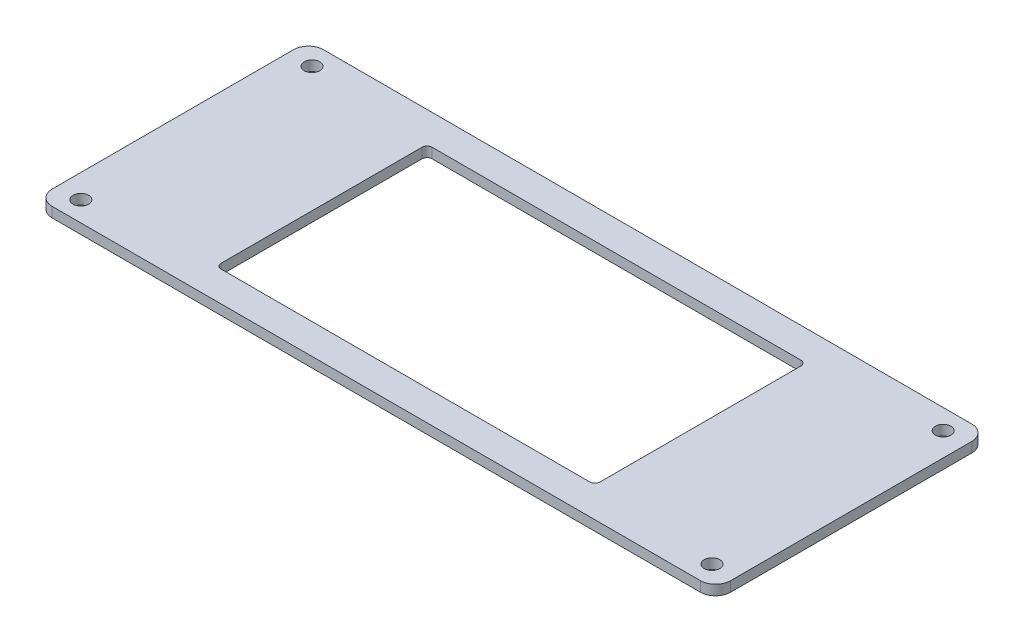
ISO-10303-21;
HEADER;
FILE_DESCRIPTION(('STEP AP214'),'2;1');
FILE_NAME('part.step','',(''),(''),'','','');
FILE_SCHEMA(('AUTOMOTIVE_DESIGN { 1 0 10303 214 1 1 1 1 }'));
ENDSEC;
DATA;
#1=APPLICATION_CONTEXT('core data for automotive mechanical design processes');
#2=APPLICATION_PROTOCOL_DEFINITION('international standard','automotive_design',2000,#1);
#3=PRODUCT_CONTEXT('',#1,'mechanical');
#4=PRODUCT('Part','Part','',(#3));
#5=PRODUCT_RELATED_PRODUCT_CATEGORY('part','',(#4));
#6=PRODUCT_DEFINITION_FORMATION('','',#4);
#7=PRODUCT_DEFINITION_CONTEXT('part definition',#1,'design');
#8=PRODUCT_DEFINITION('design','',#6,#7);
#9=PRODUCT_DEFINITION_SHAPE('','',#8);
#10=(LENGTH_UNIT() NAMED_UNIT(*) SI_UNIT(.MILLI.,.METRE.));
#11=(NAMED_UNIT(*) PLANE_ANGLE_UNIT() SI_UNIT($,.RADIAN.));
#12=(NAMED_UNIT(*) SI_UNIT($,.STERADIAN.) SOLID_ANGLE_UNIT());
#13=UNCERTAINTY_MEASURE_WITH_UNIT(LENGTH_MEASURE(1.E-05),#10,'distance_accuracy_value','');
#14=(GEOMETRIC_REPRESENTATION_CONTEXT(3) GLOBAL_UNCERTAINTY_ASSIGNED_CONTEXT((#13)) GLOBAL_UNIT_ASSIGNED_CONTEXT((#10,
#11,#12)) REPRESENTATION_CONTEXT('',''));
#15=CARTESIAN_POINT('',(0.,0.,0.));
#16=DIRECTION('',(0.,0.,1.));
#17=DIRECTION('',(1.,0.,0.));
#18=AXIS2_PLACEMENT_3D('',#15,#16,#17);
#19=CARTESIAN_POINT('',(59.5,2.,-24.));
#20=DIRECTION('',(0.,-1.,0.));
#21=DIRECTION('',(0.,0.,-1.));
#22=AXIS2_PLACEMENT_3D('',#19,#20,#21);
#23=PLANE('',#22);
#24=CARTESIAN_POINT('',(-67.8,2.,-22.9999999999999));
#25=DIRECTION('',(0.,1.,0.));
#26=DIRECTION('',(0.,0.,-1.));
#27=AXIS2_PLACEMENT_3D('',#24,#25,#26);
#28=CIRCLE('',#27,1.55000000000001);
#29=CARTESIAN_POINT('',(-67.8,2.,-24.5499999999999));
#30=VERTEX_POINT('',#29);
#31=EDGE_CURVE('E556',#30,#30,#28,.T.);
#32=ORIENTED_EDGE('',*,*,#31,.F.);
#33=EDGE_LOOP('',(#32));
#34=FACE_BOUND('',#33,.T.);
#35=CARTESIAN_POINT('',(-67.8,2.,23.0000000000001));
#36=DIRECTION('',(0.,1.,0.));
#37=DIRECTION('',(0.,0.,1.));
#38=AXIS2_PLACEMENT_3D('',#35,#36,#37);
#39=CIRCLE('',#38,1.55000000000001);
#40=CARTESIAN_POINT('',(-67.8,2.,24.5500000000001));
#41=VERTEX_POINT('',#40);
#42=EDGE_CURVE('E562',#41,#41,#39,.T.);
#43=ORIENTED_EDGE('',*,*,#42,.F.);
#44=EDGE_LOOP('',(#43));
#45=FACE_BOUND('',#44,.T.);
#46=CARTESIAN_POINT('',(57.8,2.,23.));
#47=DIRECTION('',(0.,1.,0.));
#48=DIRECTION('',(0.,0.,-1.));
#49=AXIS2_PLACEMENT_3D('',#46,#47,#48);
#50=CIRCLE('',#49,1.55);
#51=CARTESIAN_POINT('',(57.8,2.,21.45));
#52=VERTEX_POINT('',#51);
#53=EDGE_CURVE('E546',#52,#52,#50,.T.);
#54=ORIENTED_EDGE('',*,*,#53,.F.);
#55=EDGE_LOOP('',(#54));
#56=FACE_BOUND('',#55,.T.);
#57=CARTESIAN_POINT('',(57.8,2.,-23.));
#58=DIRECTION('',(0.,1.,0.));
#59=DIRECTION('',(0.,0.,1.));
#60=AXIS2_PLACEMENT_3D('',#57,#58,#59);
#61=CIRCLE('',#60,1.55);
#62=CARTESIAN_POINT('',(57.8,2.,-21.45));
#63=VERTEX_POINT('',#62);
#64=EDGE_CURVE('E544',#63,#63,#61,.T.);
#65=ORIENTED_EDGE('',*,*,#64,.F.);
#66=EDGE_LOOP('',(#65));
#67=FACE_BOUND('',#66,.T.);
#68=DIRECTION('',(0.,0.,1.));
#69=VECTOR('',#68,1.);
#70=CARTESIAN_POINT('',(-72.5,2.,-27.));
#71=LINE('',#70,#69);
#72=CARTESIAN_POINT('',(-72.5,2.,-24.));
#73=VERTEX_POINT('',#72);
#74=CARTESIAN_POINT('',(-72.5,2.,24.));
#75=VERTEX_POINT('',#74);
#76=EDGE_CURVE('E284',#73,#75,#71,.T.);
#77=ORIENTED_EDGE('',*,*,#76,.T.);
#78=CARTESIAN_POINT('',(-69.5,2.,24.));
#79=DIRECTION('',(0.,-1.,0.));
#80=DIRECTION('',(0.,0.,-1.));
#81=AXIS2_PLACEMENT_3D('',#78,#79,#80);
#82=CIRCLE('',#81,3.);
#83=CARTESIAN_POINT('',(-69.5,2.,27.));
#84=VERTEX_POINT('',#83);
#85=EDGE_CURVE('E269',#75,#84,#82,.F.);
#86=ORIENTED_EDGE('',*,*,#85,.T.);
#87=DIRECTION('',(1.,0.,0.));
#88=VECTOR('',#87,1.);
#89=CARTESIAN_POINT('',(-59.5,2.,27.));
#90=LINE('',#89,#88);
#91=CARTESIAN_POINT('',(59.5,2.,27.));
#92=VERTEX_POINT('',#91);
#93=EDGE_CURVE('E229',#84,#92,#90,.T.);
#94=ORIENTED_EDGE('',*,*,#93,.T.);
#95=CARTESIAN_POINT('',(59.5,2.,24.));
#96=DIRECTION('',(0.,1.,0.));
#97=DIRECTION('',(0.,0.,1.));
#98=AXIS2_PLACEMENT_3D('',#95,#96,#97);
#99=CIRCLE('',#98,3.);
#100=CARTESIAN_POINT('',(62.5,2.,24.));
#101=VERTEX_POINT('',#100);
#102=EDGE_CURVE('E231',#92,#101,#99,.T.);
#103=ORIENTED_EDGE('',*,*,#102,.T.);
#104=DIRECTION('',(0.,0.,-1.));
#105=VECTOR('',#104,1.);
#106=CARTESIAN_POINT('',(62.5,2.,24.));
#107=LINE('',#106,#105);
#108=CARTESIAN_POINT('',(62.5,2.,-24.));
#109=VERTEX_POINT('',#108);
#110=EDGE_CURVE('E234',#101,#109,#107,.T.);
#111=ORIENTED_EDGE('',*,*,#110,.T.);
#112=CARTESIAN_POINT('',(59.5,2.,-24.));
#113=DIRECTION('',(0.,1.,0.));
#114=DIRECTION('',(0.,0.,-1.));
#115=AXIS2_PLACEMENT_3D('',#112,#113,#114);
#116=CIRCLE('',#115,3.);
#117=CARTESIAN_POINT('',(59.5,2.,-27.));
#118=VERTEX_POINT('',#117);
#119=EDGE_CURVE('E236',#109,#118,#116,.T.);
#120=ORIENTED_EDGE('',*,*,#119,.T.);
#121=DIRECTION('',(-1.,0.,0.));
#122=VECTOR('',#121,1.);
#123=CARTESIAN_POINT('',(-59.5,2.,-27.));
#124=LINE('',#123,#122);
#125=CARTESIAN_POINT('',(-69.5,2.,-27.));
#126=VERTEX_POINT('',#125);
#127=EDGE_CURVE('E238',#118,#126,#124,.T.);
#128=ORIENTED_EDGE('',*,*,#127,.T.);
#129=CARTESIAN_POINT('',(-69.5,2.,-24.));
#130=DIRECTION('',(0.,-1.,0.));
#131=DIRECTION('',(0.,0.,-1.));
#132=AXIS2_PLACEMENT_3D('',#129,#130,#131);
#133=CIRCLE('',#132,3.);
#134=EDGE_CURVE('E267',#126,#73,#133,.F.);
#135=ORIENTED_EDGE('',*,*,#134,.T.);
#136=EDGE_LOOP('',(#77,#86,#94,#103,#111,#120,#128,#135));
#137=FACE_BOUND('',#136,.T.);
#138=CARTESIAN_POINT('',(31.5,2.,20.));
#139=DIRECTION('',(0.,1.,0.));
#140=DIRECTION('',(0.,0.,1.));
#141=AXIS2_PLACEMENT_3D('',#138,#139,#140);
#142=CIRCLE('',#141,1.);
#143=CARTESIAN_POINT('',(31.5,2.,21.));
#144=VERTEX_POINT('',#143);
#145=CARTESIAN_POINT('',(32.5,2.,20.));
#146=VERTEX_POINT('',#145);
#147=EDGE_CURVE('E157',#144,#146,#142,.T.);
#148=ORIENTED_EDGE('',*,*,#147,.F.);
#149=DIRECTION('',(1.,0.,0.));
#150=VECTOR('',#149,1.);
#151=CARTESIAN_POINT('',(-41.9,2.,21.));
#152=LINE('',#151,#150);
#153=CARTESIAN_POINT('',(-41.9,2.,21.));
#154=VERTEX_POINT('',#153);
#155=EDGE_CURVE('E194',#154,#144,#152,.T.);
#156=ORIENTED_EDGE('',*,*,#155,.F.);
#157=CARTESIAN_POINT('',(-41.9,2.,20.));
#158=DIRECTION('',(0.,1.,0.));
#159=DIRECTION('',(0.,0.,1.));
#160=AXIS2_PLACEMENT_3D('',#157,#158,#159);
#161=CIRCLE('',#160,1.);
#162=CARTESIAN_POINT('',(-42.9,2.,20.));
#163=VERTEX_POINT('',#162);
#164=EDGE_CURVE('E191',#163,#154,#161,.T.);
#165=ORIENTED_EDGE('',*,*,#164,.F.);
#166=DIRECTION('',(0.,0.,1.));
#167=VECTOR('',#166,1.);
#168=CARTESIAN_POINT('',(-42.9,2.,-20.));
#169=LINE('',#168,#167);
#170=CARTESIAN_POINT('',(-42.9,2.,-20.));
#171=VERTEX_POINT('',#170);
#172=EDGE_CURVE('E189',#171,#163,#169,.T.);
#173=ORIENTED_EDGE('',*,*,#172,.F.);
#174=CARTESIAN_POINT('',(-41.9,2.,-20.));
#175=DIRECTION('',(0.,1.,0.));
#176=DIRECTION('',(0.,0.,1.));
#177=AXIS2_PLACEMENT_3D('',#174,#175,#176);
#178=CIRCLE('',#177,1.);
#179=CARTESIAN_POINT('',(-41.9,2.,-21.));
#180=VERTEX_POINT('',#179);
#181=EDGE_CURVE('E187',#180,#171,#178,.T.);
#182=ORIENTED_EDGE('',*,*,#181,.F.);
#183=DIRECTION('',(-1.,0.,0.));
#184=VECTOR('',#183,1.);
#185=CARTESIAN_POINT('',(-41.9,2.,-21.));
#186=LINE('',#185,#184);
#187=CARTESIAN_POINT('',(31.5,2.,-21.));
#188=VERTEX_POINT('',#187);
#189=EDGE_CURVE('E182',#188,#180,#186,.T.);
#190=ORIENTED_EDGE('',*,*,#189,.F.);
#191=CARTESIAN_POINT('',(31.5,2.,-20.));
#192=DIRECTION('',(0.,1.,0.));
#193=DIRECTION('',(0.,0.,-1.));
#194=AXIS2_PLACEMENT_3D('',#191,#192,#193);
#195=CIRCLE('',#194,1.);
#196=CARTESIAN_POINT('',(32.5,2.,-20.));
#197=VERTEX_POINT('',#196);
#198=EDGE_CURVE('E180',#197,#188,#195,.T.);
#199=ORIENTED_EDGE('',*,*,#198,.F.);
#200=DIRECTION('',(0.,0.,-1.));
#201=VECTOR('',#200,1.);
#202=CARTESIAN_POINT('',(32.5,2.,-20.));
#203=LINE('',#202,#201);
#204=EDGE_CURVE('E167',#146,#197,#203,.T.);
#205=ORIENTED_EDGE('',*,*,#204,.F.);
#206=EDGE_LOOP('',(#148,#156,#165,#173,#182,#190,#199,#205));
#207=FACE_BOUND('',#206,.T.);
#208=ADVANCED_FACE('F41',(#34,#45,#56,#67,#137,#207),#23,.F.);
#209=CARTESIAN_POINT('',(59.5,0.,-24.));
#210=DIRECTION('',(0.,-1.,0.));
#211=DIRECTION('',(0.,0.,-1.));
#212=AXIS2_PLACEMENT_3D('',#209,#210,#211);
#213=PLANE('',#212);
#214=CARTESIAN_POINT('',(-67.8,0.,-22.9999999999999));
#215=DIRECTION('',(0.,1.,0.));
#216=DIRECTION('',(0.,0.,-1.));
#217=AXIS2_PLACEMENT_3D('',#214,#215,#216);
#218=CIRCLE('',#217,1.55000000000001);
#219=CARTESIAN_POINT('',(-67.8,0.,-24.5499999999999));
#220=VERTEX_POINT('',#219);
#221=EDGE_CURVE('E553',#220,#220,#218,.T.);
#222=ORIENTED_EDGE('',*,*,#221,.T.);
#223=EDGE_LOOP('',(#222));
#224=FACE_BOUND('',#223,.T.);
#225=CARTESIAN_POINT('',(-67.8,0.,23.0000000000001));
#226=DIRECTION('',(0.,1.,0.));
#227=DIRECTION('',(0.,0.,1.));
#228=AXIS2_PLACEMENT_3D('',#225,#226,#227);
#229=CIRCLE('',#228,1.55000000000001);
#230=CARTESIAN_POINT('',(-67.8,0.,24.5500000000001));
#231=VERTEX_POINT('',#230);
#232=EDGE_CURVE('E559',#231,#231,#229,.T.);
#233=ORIENTED_EDGE('',*,*,#232,.T.);
#234=EDGE_LOOP('',(#233));
#235=FACE_BOUND('',#234,.T.);
#236=CARTESIAN_POINT('',(57.8,0.,23.));
#237=DIRECTION('',(0.,1.,0.));
#238=DIRECTION('',(0.,0.,-1.));
#239=AXIS2_PLACEMENT_3D('',#236,#237,#238);
#240=CIRCLE('',#239,1.55);
#241=CARTESIAN_POINT('',(57.8,0.,21.45));
#242=VERTEX_POINT('',#241);
#243=EDGE_CURVE('E550',#242,#242,#240,.T.);
#244=ORIENTED_EDGE('',*,*,#243,.T.);
#245=EDGE_LOOP('',(#244));
#246=FACE_BOUND('',#245,.T.);
#247=CARTESIAN_POINT('',(57.8,0.,-23.));
#248=DIRECTION('',(0.,1.,0.));
#249=DIRECTION('',(0.,0.,1.));
#250=AXIS2_PLACEMENT_3D('',#247,#248,#249);
#251=CIRCLE('',#250,1.55);
#252=CARTESIAN_POINT('',(57.8,0.,-21.45));
#253=VERTEX_POINT('',#252);
#254=EDGE_CURVE('E308',#253,#253,#251,.T.);
#255=ORIENTED_EDGE('',*,*,#254,.T.);
#256=EDGE_LOOP('',(#255));
#257=FACE_BOUND('',#256,.T.);
#258=DIRECTION('',(1.,0.,0.));
#259=VECTOR('',#258,1.);
#260=CARTESIAN_POINT('',(-59.5,0.,27.));
#261=LINE('',#260,#259);
#262=CARTESIAN_POINT('',(-69.5,0.,27.));
#263=VERTEX_POINT('',#262);
#264=CARTESIAN_POINT('',(59.5,0.,27.));
#265=VERTEX_POINT('',#264);
#266=EDGE_CURVE('E175',#263,#265,#261,.T.);
#267=ORIENTED_EDGE('',*,*,#266,.F.);
#268=CARTESIAN_POINT('',(-69.5,0.,24.));
#269=DIRECTION('',(0.,-1.,0.));
#270=DIRECTION('',(0.,0.,-1.));
#271=AXIS2_PLACEMENT_3D('',#268,#269,#270);
#272=CIRCLE('',#271,3.);
#273=CARTESIAN_POINT('',(-72.5,0.,24.));
#274=VERTEX_POINT('',#273);
#275=EDGE_CURVE('E49',#263,#274,#272,.T.);
#276=ORIENTED_EDGE('',*,*,#275,.T.);
#277=DIRECTION('',(0.,0.,1.));
#278=VECTOR('',#277,1.);
#279=CARTESIAN_POINT('',(-72.5,0.,-27.));
#280=LINE('',#279,#278);
#281=CARTESIAN_POINT('',(-72.5,0.,-24.));
#282=VERTEX_POINT('',#281);
#283=EDGE_CURVE('E198',#282,#274,#280,.T.);
#284=ORIENTED_EDGE('',*,*,#283,.F.);
#285=CARTESIAN_POINT('',(-69.5,0.,-24.));
#286=DIRECTION('',(0.,-1.,0.));
#287=DIRECTION('',(0.,0.,-1.));
#288=AXIS2_PLACEMENT_3D('',#285,#286,#287);
#289=CIRCLE('',#288,3.);
#290=CARTESIAN_POINT('',(-69.5,0.,-27.));
#291=VERTEX_POINT('',#290);
#292=EDGE_CURVE('E56',#282,#291,#289,.T.);
#293=ORIENTED_EDGE('',*,*,#292,.T.);
#294=DIRECTION('',(-1.,0.,0.));
#295=VECTOR('',#294,1.);
#296=CARTESIAN_POINT('',(-59.5,0.,-27.));
#297=LINE('',#296,#295);
#298=CARTESIAN_POINT('',(59.5,0.,-27.));
#299=VERTEX_POINT('',#298);
#300=EDGE_CURVE('E232',#299,#291,#297,.T.);
#301=ORIENTED_EDGE('',*,*,#300,.F.);
#302=CARTESIAN_POINT('',(59.5,0.,-24.));
#303=DIRECTION('',(0.,1.,0.));
#304=DIRECTION('',(0.,0.,-1.));
#305=AXIS2_PLACEMENT_3D('',#302,#303,#304);
#306=CIRCLE('',#305,3.);
#307=CARTESIAN_POINT('',(62.5,0.,-24.));
#308=VERTEX_POINT('',#307);
#309=EDGE_CURVE('E247',#308,#299,#306,.T.);
#310=ORIENTED_EDGE('',*,*,#309,.F.);
#311=DIRECTION('',(0.,0.,-1.));
#312=VECTOR('',#311,1.);
#313=CARTESIAN_POINT('',(62.5,0.,24.));
#314=LINE('',#313,#312);
#315=CARTESIAN_POINT('',(62.5,0.,24.));
#316=VERTEX_POINT('',#315);
#317=EDGE_CURVE('E245',#316,#308,#314,.T.);
#318=ORIENTED_EDGE('',*,*,#317,.F.);
#319=CARTESIAN_POINT('',(59.5,0.,24.));
#320=DIRECTION('',(0.,1.,0.));
#321=DIRECTION('',(0.,0.,1.));
#322=AXIS2_PLACEMENT_3D('',#319,#320,#321);
#323=CIRCLE('',#322,3.);
#324=EDGE_CURVE('E243',#265,#316,#323,.T.);
#325=ORIENTED_EDGE('',*,*,#324,.F.);
#326=EDGE_LOOP('',(#267,#276,#284,#293,#301,#310,#318,#325));
#327=FACE_BOUND('',#326,.T.);
#328=DIRECTION('',(1.,0.,0.));
#329=VECTOR('',#328,1.);
#330=CARTESIAN_POINT('',(-41.9,0.,21.));
#331=LINE('',#330,#329);
#332=CARTESIAN_POINT('',(-41.9,0.,21.));
#333=VERTEX_POINT('',#332);
#334=CARTESIAN_POINT('',(31.5,0.,21.));
#335=VERTEX_POINT('',#334);
#336=EDGE_CURVE('E168',#333,#335,#331,.T.);
#337=ORIENTED_EDGE('',*,*,#336,.T.);
#338=CARTESIAN_POINT('',(31.5,0.,20.));
#339=DIRECTION('',(0.,1.,0.));
#340=DIRECTION('',(0.,0.,1.));
#341=AXIS2_PLACEMENT_3D('',#338,#339,#340);
#342=CIRCLE('',#341,1.);
#343=CARTESIAN_POINT('',(32.5,0.,20.));
#344=VERTEX_POINT('',#343);
#345=EDGE_CURVE('E196',#335,#344,#342,.T.);
#346=ORIENTED_EDGE('',*,*,#345,.T.);
#347=DIRECTION('',(0.,0.,-1.));
#348=VECTOR('',#347,1.);
#349=CARTESIAN_POINT('',(32.5,0.,-20.));
#350=LINE('',#349,#348);
#351=CARTESIAN_POINT('',(32.5,0.,-20.));
#352=VERTEX_POINT('',#351);
#353=EDGE_CURVE('E174',#344,#352,#350,.T.);
#354=ORIENTED_EDGE('',*,*,#353,.T.);
#355=CARTESIAN_POINT('',(31.5,0.,-20.));
#356=DIRECTION('',(0.,1.,0.));
#357=DIRECTION('',(0.,0.,-1.));
#358=AXIS2_PLACEMENT_3D('',#355,#356,#357);
#359=CIRCLE('',#358,1.);
#360=CARTESIAN_POINT('',(31.5,0.,-21.));
#361=VERTEX_POINT('',#360);
#362=EDGE_CURVE('E200',#352,#361,#359,.T.);
#363=ORIENTED_EDGE('',*,*,#362,.T.);
#364=DIRECTION('',(-1.,0.,0.));
#365=VECTOR('',#364,1.);
#366=CARTESIAN_POINT('',(-41.9,0.,-21.));
#367=LINE('',#366,#365);
#368=CARTESIAN_POINT('',(-41.9,0.,-21.));
#369=VERTEX_POINT('',#368);
#370=EDGE_CURVE('E203',#361,#369,#367,.T.);
#371=ORIENTED_EDGE('',*,*,#370,.T.);
#372=CARTESIAN_POINT('',(-41.9,0.,-20.));
#373=DIRECTION('',(0.,1.,0.));
#374=DIRECTION('',(0.,0.,1.));
#375=AXIS2_PLACEMENT_3D('',#372,#373,#374);
#376=CIRCLE('',#375,1.);
#377=CARTESIAN_POINT('',(-42.9,0.,-20.));
#378=VERTEX_POINT('',#377);
#379=EDGE_CURVE('E206',#369,#378,#376,.T.);
#380=ORIENTED_EDGE('',*,*,#379,.T.);
#381=DIRECTION('',(0.,0.,1.));
#382=VECTOR('',#381,1.);
#383=CARTESIAN_POINT('',(-42.9,0.,-20.));
#384=LINE('',#383,#382);
#385=CARTESIAN_POINT('',(-42.9,0.,20.));
#386=VERTEX_POINT('',#385);
#387=EDGE_CURVE('E209',#378,#386,#384,.T.);
#388=ORIENTED_EDGE('',*,*,#387,.T.);
#389=CARTESIAN_POINT('',(-41.9,0.,20.));
#390=DIRECTION('',(0.,1.,0.));
#391=DIRECTION('',(0.,0.,1.));
#392=AXIS2_PLACEMENT_3D('',#389,#390,#391);
#393=CIRCLE('',#392,1.);
#394=EDGE_CURVE('E212',#386,#333,#393,.T.);
#395=ORIENTED_EDGE('',*,*,#394,.T.);
#396=EDGE_LOOP('',(#337,#346,#354,#363,#371,#380,#388,#395));
#397=FACE_BOUND('',#396,.T.);
#398=ADVANCED_FACE('F274',(#224,#235,#246,#257,#327,#397),#213,.T.);
#399=CARTESIAN_POINT('',(-59.5,2.,27.));
#400=DIRECTION('',(0.,0.,-1.));
#401=DIRECTION('',(-1.,0.,0.));
#402=AXIS2_PLACEMENT_3D('',#399,#400,#401);
#403=PLANE('',#402);
#404=ORIENTED_EDGE('',*,*,#93,.F.);
#405=DIRECTION('',(0.,1.,0.));
#406=VECTOR('',#405,1.);
#407=CARTESIAN_POINT('',(-69.5,0.,27.));
#408=LINE('',#407,#406);
#409=EDGE_CURVE('E64',#84,#263,#408,.F.);
#410=ORIENTED_EDGE('',*,*,#409,.T.);
#411=ORIENTED_EDGE('',*,*,#266,.T.);
#412=DIRECTION('',(0.,-1.,0.));
#413=VECTOR('',#412,1.);
#414=CARTESIAN_POINT('',(59.5,2.,27.));
#415=LINE('',#414,#413);
#416=EDGE_CURVE('E259',#92,#265,#415,.T.);
#417=ORIENTED_EDGE('',*,*,#416,.F.);
#418=EDGE_LOOP('',(#404,#410,#411,#417));
#419=FACE_BOUND('',#418,.T.);
#420=ADVANCED_FACE('F288',(#419),#403,.F.);
#421=CARTESIAN_POINT('',(59.5,2.,24.));
#422=DIRECTION('',(0.,-1.,0.));
#423=DIRECTION('',(0.,0.,-1.));
#424=AXIS2_PLACEMENT_3D('',#421,#422,#423);
#425=CYLINDRICAL_SURFACE('',#424,3.);
#426=ORIENTED_EDGE('',*,*,#324,.T.);
#427=DIRECTION('',(0.,-1.,0.));
#428=VECTOR('',#427,1.);
#429=CARTESIAN_POINT('',(62.5,2.,24.));
#430=LINE('',#429,#428);
#431=EDGE_CURVE('E256',#101,#316,#430,.T.);
#432=ORIENTED_EDGE('',*,*,#431,.F.);
#433=ORIENTED_EDGE('',*,*,#102,.F.);
#434=ORIENTED_EDGE('',*,*,#416,.T.);
#435=EDGE_LOOP('',(#426,#432,#433,#434));
#436=FACE_BOUND('',#435,.T.);
#437=ADVANCED_FACE('F292',(#436),#425,.T.);
#438=CARTESIAN_POINT('',(62.5,2.,24.));
#439=DIRECTION('',(-1.,0.,0.));
#440=DIRECTION('',(0.,0.,1.));
#441=AXIS2_PLACEMENT_3D('',#438,#439,#440);
#442=PLANE('',#441);
#443=ORIENTED_EDGE('',*,*,#317,.T.);
#444=DIRECTION('',(0.,-1.,0.));
#445=VECTOR('',#444,1.);
#446=CARTESIAN_POINT('',(62.5,2.,-24.));
#447=LINE('',#446,#445);
#448=EDGE_CURVE('E253',#109,#308,#447,.T.);
#449=ORIENTED_EDGE('',*,*,#448,.F.);
#450=ORIENTED_EDGE('',*,*,#110,.F.);
#451=ORIENTED_EDGE('',*,*,#431,.T.);
#452=EDGE_LOOP('',(#443,#449,#450,#451));
#453=FACE_BOUND('',#452,.T.);
#454=ADVANCED_FACE('F298',(#453),#442,.F.);
#455=CARTESIAN_POINT('',(59.5,2.,-24.));
#456=DIRECTION('',(0.,-1.,0.));
#457=DIRECTION('',(0.,0.,-1.));
#458=AXIS2_PLACEMENT_3D('',#455,#456,#457);
#459=CYLINDRICAL_SURFACE('',#458,3.);
#460=ORIENTED_EDGE('',*,*,#309,.T.);
#461=DIRECTION('',(0.,-1.,0.));
#462=VECTOR('',#461,1.);
#463=CARTESIAN_POINT('',(59.5,2.,-27.));
#464=LINE('',#463,#462);
#465=EDGE_CURVE('E241',#118,#299,#464,.T.);
#466=ORIENTED_EDGE('',*,*,#465,.F.);
#467=ORIENTED_EDGE('',*,*,#119,.F.);
#468=ORIENTED_EDGE('',*,*,#448,.T.);
#469=EDGE_LOOP('',(#460,#466,#467,#468));
#470=FACE_BOUND('',#469,.T.);
#471=ADVANCED_FACE('F302',(#470),#459,.T.);
#472=CARTESIAN_POINT('',(-59.5,2.,-27.));
#473=DIRECTION('',(0.,0.,1.));
#474=DIRECTION('',(1.,0.,0.));
#475=AXIS2_PLACEMENT_3D('',#472,#473,#474);
#476=PLANE('',#475);
#477=ORIENTED_EDGE('',*,*,#300,.T.);
#478=DIRECTION('',(0.,1.,0.));
#479=VECTOR('',#478,1.);
#480=CARTESIAN_POINT('',(-69.5,2.,-27.));
#481=LINE('',#480,#479);
#482=EDGE_CURVE('E11',#291,#126,#481,.T.);
#483=ORIENTED_EDGE('',*,*,#482,.T.);
#484=ORIENTED_EDGE('',*,*,#127,.F.);
#485=ORIENTED_EDGE('',*,*,#465,.T.);
#486=EDGE_LOOP('',(#477,#483,#484,#485));
#487=FACE_BOUND('',#486,.T.);
#488=ADVANCED_FACE('F305',(#487),#476,.F.);
#489=CARTESIAN_POINT('',(31.5,2.,20.));
#490=DIRECTION('',(0.,-1.,0.));
#491=DIRECTION('',(0.,0.,-1.));
#492=AXIS2_PLACEMENT_3D('',#489,#490,#491);
#493=CYLINDRICAL_SURFACE('',#492,1.);
#494=ORIENTED_EDGE('',*,*,#345,.F.);
#495=DIRECTION('',(0.,-1.,0.));
#496=VECTOR('',#495,1.);
#497=CARTESIAN_POINT('',(31.5,2.,21.));
#498=LINE('',#497,#496);
#499=EDGE_CURVE('E163',#144,#335,#498,.T.);
#500=ORIENTED_EDGE('',*,*,#499,.F.);
#501=ORIENTED_EDGE('',*,*,#147,.T.);
#502=DIRECTION('',(0.,-1.,0.));
#503=VECTOR('',#502,1.);
#504=CARTESIAN_POINT('',(32.5,2.,20.));
#505=LINE('',#504,#503);
#506=EDGE_CURVE('E160',#146,#344,#505,.T.);
#507=ORIENTED_EDGE('',*,*,#506,.T.);
#508=EDGE_LOOP('',(#494,#500,#501,#507));
#509=FACE_BOUND('',#508,.T.);
#510=ADVANCED_FACE('F159',(#509),#493,.F.);
#511=CARTESIAN_POINT('',(32.5,2.,-20.));
#512=DIRECTION('',(-1.,0.,0.));
#513=DIRECTION('',(0.,0.,1.));
#514=AXIS2_PLACEMENT_3D('',#511,#512,#513);
#515=PLANE('',#514);
#516=ORIENTED_EDGE('',*,*,#353,.F.);
#517=ORIENTED_EDGE('',*,*,#506,.F.);
#518=ORIENTED_EDGE('',*,*,#204,.T.);
#519=DIRECTION('',(0.,-1.,0.));
#520=VECTOR('',#519,1.);
#521=CARTESIAN_POINT('',(32.5,2.,-20.));
#522=LINE('',#521,#520);
#523=EDGE_CURVE('E176',#197,#352,#522,.T.);
#524=ORIENTED_EDGE('',*,*,#523,.T.);
#525=EDGE_LOOP('',(#516,#517,#518,#524));
#526=FACE_BOUND('',#525,.T.);
#527=ADVANCED_FACE('F171',(#526),#515,.T.);
#528=CARTESIAN_POINT('',(31.5,2.,-20.));
#529=DIRECTION('',(0.,-1.,0.));
#530=DIRECTION('',(0.,0.,-1.));
#531=AXIS2_PLACEMENT_3D('',#528,#529,#530);
#532=CYLINDRICAL_SURFACE('',#531,1.);
#533=ORIENTED_EDGE('',*,*,#362,.F.);
#534=ORIENTED_EDGE('',*,*,#523,.F.);
#535=ORIENTED_EDGE('',*,*,#198,.T.);
#536=DIRECTION('',(0.,-1.,0.));
#537=VECTOR('',#536,1.);
#538=CARTESIAN_POINT('',(31.5,2.,-21.));
#539=LINE('',#538,#537);
#540=EDGE_CURVE('E226',#188,#361,#539,.T.);
#541=ORIENTED_EDGE('',*,*,#540,.T.);
#542=EDGE_LOOP('',(#533,#534,#535,#541));
#543=FACE_BOUND('',#542,.T.);
#544=ADVANCED_FACE('F446',(#543),#532,.F.);
#545=CARTESIAN_POINT('',(-41.9,2.,-21.));
#546=DIRECTION('',(0.,0.,1.));
#547=DIRECTION('',(1.,0.,0.));
#548=AXIS2_PLACEMENT_3D('',#545,#546,#547);
#549=PLANE('',#548);
#550=ORIENTED_EDGE('',*,*,#370,.F.);
#551=ORIENTED_EDGE('',*,*,#540,.F.);
#552=ORIENTED_EDGE('',*,*,#189,.T.);
#553=DIRECTION('',(0.,-1.,0.));
#554=VECTOR('',#553,1.);
#555=CARTESIAN_POINT('',(-41.9,2.,-21.));
#556=LINE('',#555,#554);
#557=EDGE_CURVE('E224',#180,#369,#556,.T.);
#558=ORIENTED_EDGE('',*,*,#557,.T.);
#559=EDGE_LOOP('',(#550,#551,#552,#558));
#560=FACE_BOUND('',#559,.T.);
#561=ADVANCED_FACE('F437',(#560),#549,.T.);
#562=CARTESIAN_POINT('',(-41.9,2.,-20.));
#563=DIRECTION('',(0.,-1.,0.));
#564=DIRECTION('',(0.,0.,-1.));
#565=AXIS2_PLACEMENT_3D('',#562,#563,#564);
#566=CYLINDRICAL_SURFACE('',#565,1.);
#567=ORIENTED_EDGE('',*,*,#379,.F.);
#568=ORIENTED_EDGE('',*,*,#557,.F.);
#569=ORIENTED_EDGE('',*,*,#181,.T.);
#570=DIRECTION('',(0.,-1.,0.));
#571=VECTOR('',#570,1.);
#572=CARTESIAN_POINT('',(-42.9,2.,-20.));
#573=LINE('',#572,#571);
#574=EDGE_CURVE('E222',#171,#378,#573,.T.);
#575=ORIENTED_EDGE('',*,*,#574,.T.);
#576=EDGE_LOOP('',(#567,#568,#569,#575));
#577=FACE_BOUND('',#576,.T.);
#578=ADVANCED_FACE('F428',(#577),#566,.F.);
#579=CARTESIAN_POINT('',(-42.9,2.,-20.));
#580=DIRECTION('',(1.,0.,0.));
#581=DIRECTION('',(0.,0.,-1.));
#582=AXIS2_PLACEMENT_3D('',#579,#580,#581);
#583=PLANE('',#582);
#584=ORIENTED_EDGE('',*,*,#387,.F.);
#585=ORIENTED_EDGE('',*,*,#574,.F.);
#586=ORIENTED_EDGE('',*,*,#172,.T.);
#587=DIRECTION('',(0.,-1.,0.));
#588=VECTOR('',#587,1.);
#589=CARTESIAN_POINT('',(-42.9,2.,20.));
#590=LINE('',#589,#588);
#591=EDGE_CURVE('E220',#163,#386,#590,.T.);
#592=ORIENTED_EDGE('',*,*,#591,.T.);
#593=EDGE_LOOP('',(#584,#585,#586,#592));
#594=FACE_BOUND('',#593,.T.);
#595=ADVANCED_FACE('F419',(#594),#583,.T.);
#596=CARTESIAN_POINT('',(-41.9,2.,20.));
#597=DIRECTION('',(0.,-1.,0.));
#598=DIRECTION('',(0.,0.,-1.));
#599=AXIS2_PLACEMENT_3D('',#596,#597,#598);
#600=CYLINDRICAL_SURFACE('',#599,1.);
#601=ORIENTED_EDGE('',*,*,#394,.F.);
#602=ORIENTED_EDGE('',*,*,#591,.F.);
#603=ORIENTED_EDGE('',*,*,#164,.T.);
#604=DIRECTION('',(0.,-1.,0.));
#605=VECTOR('',#604,1.);
#606=CARTESIAN_POINT('',(-41.9,2.,21.));
#607=LINE('',#606,#605);
#608=EDGE_CURVE('E218',#154,#333,#607,.T.);
#609=ORIENTED_EDGE('',*,*,#608,.T.);
#610=EDGE_LOOP('',(#601,#602,#603,#609));
#611=FACE_BOUND('',#610,.T.);
#612=ADVANCED_FACE('F410',(#611),#600,.F.);
#613=CARTESIAN_POINT('',(-41.9,2.,21.));
#614=DIRECTION('',(0.,0.,-1.));
#615=DIRECTION('',(-1.,0.,0.));
#616=AXIS2_PLACEMENT_3D('',#613,#614,#615);
#617=PLANE('',#616);
#618=ORIENTED_EDGE('',*,*,#336,.F.);
#619=ORIENTED_EDGE('',*,*,#608,.F.);
#620=ORIENTED_EDGE('',*,*,#155,.T.);
#621=ORIENTED_EDGE('',*,*,#499,.T.);
#622=EDGE_LOOP('',(#618,#619,#620,#621));
#623=FACE_BOUND('',#622,.T.);
#624=ADVANCED_FACE('F354',(#623),#617,.T.);
#625=CARTESIAN_POINT('',(-72.5,-54.9181208709839,-27.));
#626=DIRECTION('',(-1.,0.,0.));
#627=DIRECTION('',(0.,0.,1.));
#628=AXIS2_PLACEMENT_3D('',#625,#626,#627);
#629=PLANE('',#628);
#630=ORIENTED_EDGE('',*,*,#283,.T.);
#631=DIRECTION('',(0.,1.,0.));
#632=VECTOR('',#631,1.);
#633=CARTESIAN_POINT('',(-72.5,2.,24.));
#634=LINE('',#633,#632);
#635=EDGE_CURVE('E264',#274,#75,#634,.T.);
#636=ORIENTED_EDGE('',*,*,#635,.T.);
#637=ORIENTED_EDGE('',*,*,#76,.F.);
#638=DIRECTION('',(0.,1.,0.));
#639=VECTOR('',#638,1.);
#640=CARTESIAN_POINT('',(-72.5,0.,-24.));
#641=LINE('',#640,#639);
#642=EDGE_CURVE('E262',#73,#282,#641,.F.);
#643=ORIENTED_EDGE('',*,*,#642,.T.);
#644=EDGE_LOOP('',(#630,#636,#637,#643));
#645=FACE_BOUND('',#644,.T.);
#646=ADVANCED_FACE('F280',(#645),#629,.T.);
#647=CARTESIAN_POINT('',(57.8,0.,-23.));
#648=DIRECTION('',(0.,1.,0.));
#649=DIRECTION('',(0.,0.,1.));
#650=AXIS2_PLACEMENT_3D('',#647,#648,#649);
#651=CYLINDRICAL_SURFACE('',#650,1.55);
#652=ORIENTED_EDGE('',*,*,#254,.F.);
#653=EDGE_LOOP('',(#652));
#654=FACE_BOUND('',#653,.T.);
#655=ORIENTED_EDGE('',*,*,#64,.T.);
#656=EDGE_LOOP('',(#655));
#657=FACE_BOUND('',#656,.T.);
#658=ADVANCED_FACE('F353',(#654,#657),#651,.F.);
#659=CARTESIAN_POINT('',(57.8,0.,23.));
#660=DIRECTION('',(0.,1.,0.));
#661=DIRECTION('',(0.,0.,1.));
#662=AXIS2_PLACEMENT_3D('',#659,#660,#661);
#663=CYLINDRICAL_SURFACE('',#662,1.55);
#664=ORIENTED_EDGE('',*,*,#243,.F.);
#665=EDGE_LOOP('',(#664));
#666=FACE_BOUND('',#665,.T.);
#667=ORIENTED_EDGE('',*,*,#53,.T.);
#668=EDGE_LOOP('',(#667));
#669=FACE_BOUND('',#668,.T.);
#670=ADVANCED_FACE('F385',(#666,#669),#663,.F.);
#671=CARTESIAN_POINT('',(-67.8,0.,23.0000000000001));
#672=DIRECTION('',(0.,1.,0.));
#673=DIRECTION('',(0.,0.,1.));
#674=AXIS2_PLACEMENT_3D('',#671,#672,#673);
#675=CYLINDRICAL_SURFACE('',#674,1.55000000000001);
#676=ORIENTED_EDGE('',*,*,#232,.F.);
#677=EDGE_LOOP('',(#676));
#678=FACE_BOUND('',#677,.T.);
#679=ORIENTED_EDGE('',*,*,#42,.T.);
#680=EDGE_LOOP('',(#679));
#681=FACE_BOUND('',#680,.T.);
#682=ADVANCED_FACE('F375',(#678,#681),#675,.F.);
#683=CARTESIAN_POINT('',(-67.8,0.,-22.9999999999999));
#684=DIRECTION('',(0.,1.,0.));
#685=DIRECTION('',(0.,0.,1.));
#686=AXIS2_PLACEMENT_3D('',#683,#684,#685);
#687=CYLINDRICAL_SURFACE('',#686,1.55000000000001);
#688=ORIENTED_EDGE('',*,*,#221,.F.);
#689=EDGE_LOOP('',(#688));
#690=FACE_BOUND('',#689,.T.);
#691=ORIENTED_EDGE('',*,*,#31,.T.);
#692=EDGE_LOOP('',(#691));
#693=FACE_BOUND('',#692,.T.);
#694=ADVANCED_FACE('F314',(#690,#693),#687,.F.);
#695=CARTESIAN_POINT('',(-69.5,-54.9181208709839,24.));
#696=DIRECTION('',(0.,-1.,0.));
#697=DIRECTION('',(0.,0.,-1.));
#698=AXIS2_PLACEMENT_3D('',#695,#696,#697);
#699=CYLINDRICAL_SURFACE('',#698,3.);
#700=ORIENTED_EDGE('',*,*,#275,.F.);
#701=ORIENTED_EDGE('',*,*,#409,.F.);
#702=ORIENTED_EDGE('',*,*,#85,.F.);
#703=ORIENTED_EDGE('',*,*,#635,.F.);
#704=EDGE_LOOP('',(#700,#701,#702,#703));
#705=FACE_BOUND('',#704,.T.);
#706=ADVANCED_FACE('F285',(#705),#699,.T.);
#707=CARTESIAN_POINT('',(-69.5,2.,-24.));
#708=DIRECTION('',(0.,-1.,0.));
#709=DIRECTION('',(0.,0.,-1.));
#710=AXIS2_PLACEMENT_3D('',#707,#708,#709);
#711=CYLINDRICAL_SURFACE('',#710,3.);
#712=ORIENTED_EDGE('',*,*,#292,.F.);
#713=ORIENTED_EDGE('',*,*,#642,.F.);
#714=ORIENTED_EDGE('',*,*,#134,.F.);
#715=ORIENTED_EDGE('',*,*,#482,.F.);
#716=EDGE_LOOP('',(#712,#713,#714,#715));
#717=FACE_BOUND('',#716,.T.);
#718=ADVANCED_FACE('F43',(#717),#711,.T.);
#719=CLOSED_SHELL('',(#208,#398,#420,#437,#454,#471,#488,#510,#527,#544,#561,#578,#595,#612,
#624,#646,#658,#670,#682,#694,#706,#718));
#720=MANIFOLD_SOLID_BREP('B2',#719);
#721=ADVANCED_BREP_SHAPE_REPRESENTATION('',(#18,#720),#14);
#722=SHAPE_DEFINITION_REPRESENTATION(#9,#721);
ENDSEC;
END-ISO-10303-21;
